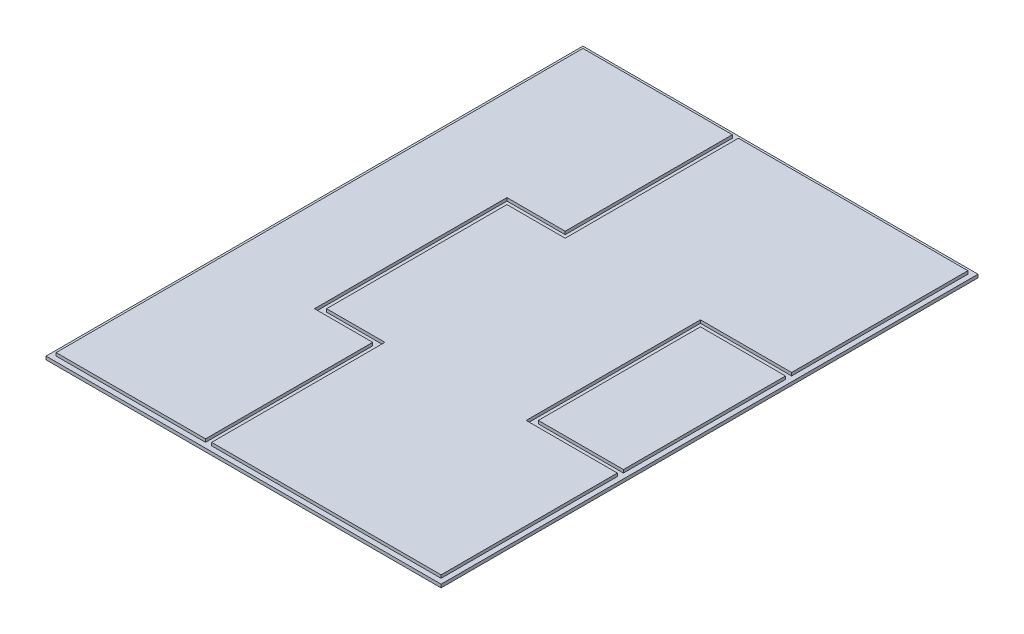
ISO-10303-21;
HEADER;
FILE_DESCRIPTION(('STEP AP214'),'2;1');
FILE_NAME('part.step','',(''),(''),'','','');
FILE_SCHEMA(('AUTOMOTIVE_DESIGN { 1 0 10303 214 1 1 1 1 }'));
ENDSEC;
DATA;
#1=APPLICATION_CONTEXT('core data for automotive mechanical design processes');
#2=APPLICATION_PROTOCOL_DEFINITION('international standard','automotive_design',2000,#1);
#3=PRODUCT_CONTEXT('',#1,'mechanical');
#4=PRODUCT('Part','Part','',(#3));
#5=PRODUCT_RELATED_PRODUCT_CATEGORY('part','',(#4));
#6=PRODUCT_DEFINITION_FORMATION('','',#4);
#7=PRODUCT_DEFINITION_CONTEXT('part definition',#1,'design');
#8=PRODUCT_DEFINITION('design','',#6,#7);
#9=PRODUCT_DEFINITION_SHAPE('','',#8);
#10=(LENGTH_UNIT() NAMED_UNIT(*) SI_UNIT(.MILLI.,.METRE.));
#11=(NAMED_UNIT(*) PLANE_ANGLE_UNIT() SI_UNIT($,.RADIAN.));
#12=(NAMED_UNIT(*) SI_UNIT($,.STERADIAN.) SOLID_ANGLE_UNIT());
#13=UNCERTAINTY_MEASURE_WITH_UNIT(LENGTH_MEASURE(1.E-05),#10,'distance_accuracy_value','');
#14=(GEOMETRIC_REPRESENTATION_CONTEXT(3) GLOBAL_UNCERTAINTY_ASSIGNED_CONTEXT((#13)) GLOBAL_UNIT_ASSIGNED_CONTEXT((#10,
#11,#12)) REPRESENTATION_CONTEXT('',''));
#15=CARTESIAN_POINT('',(0.,0.,0.));
#16=DIRECTION('',(0.,0.,1.));
#17=DIRECTION('',(1.,0.,0.));
#18=AXIS2_PLACEMENT_3D('',#15,#16,#17);
#19=CARTESIAN_POINT('',(-13.7444933920705,0.,-33.5859030837004));
#20=DIRECTION('',(0.,-1.,0.));
#21=DIRECTION('',(0.,0.,-1.));
#22=AXIS2_PLACEMENT_3D('',#19,#20,#21);
#23=PLANE('',#22);
#24=DIRECTION('',(0.,0.,1.));
#25=VECTOR('',#24,1.);
#26=CARTESIAN_POINT('',(-13.7444933920705,0.,-33.5859030837004));
#27=LINE('',#26,#25);
#28=CARTESIAN_POINT('',(-13.7444933920705,0.,-33.5859030837004));
#29=VERTEX_POINT('',#28);
#30=CARTESIAN_POINT('',(-13.7444933920705,0.,19.4140969162996));
#31=VERTEX_POINT('',#30);
#32=EDGE_CURVE('E125',#29,#31,#27,.T.);
#33=ORIENTED_EDGE('',*,*,#32,.F.);
#34=DIRECTION('',(-1.,0.,0.));
#35=VECTOR('',#34,1.);
#36=CARTESIAN_POINT('',(-13.7444933920705,0.,-33.5859030837004));
#37=LINE('',#36,#35);
#38=CARTESIAN_POINT('',(25.2555066079295,0.,-33.5859030837004));
#39=VERTEX_POINT('',#38);
#40=EDGE_CURVE('E97',#39,#29,#37,.T.);
#41=ORIENTED_EDGE('',*,*,#40,.F.);
#42=DIRECTION('',(0.,0.,-1.));
#43=VECTOR('',#42,1.);
#44=CARTESIAN_POINT('',(25.2555066079295,0.,-33.5859030837004));
#45=LINE('',#44,#43);
#46=CARTESIAN_POINT('',(25.2555066079295,0.,19.4140969162996));
#47=VERTEX_POINT('',#46);
#48=EDGE_CURVE('E91',#47,#39,#45,.T.);
#49=ORIENTED_EDGE('',*,*,#48,.F.);
#50=DIRECTION('',(1.,0.,0.));
#51=VECTOR('',#50,1.);
#52=CARTESIAN_POINT('',(-13.7444933920705,0.,19.4140969162996));
#53=LINE('',#52,#51);
#54=EDGE_CURVE('E114',#31,#47,#53,.T.);
#55=ORIENTED_EDGE('',*,*,#54,.F.);
#56=EDGE_LOOP('',(#33,#41,#49,#55));
#57=FACE_BOUND('',#56,.T.);
#58=ADVANCED_FACE('F57',(#57),#23,.T.);
#59=CARTESIAN_POINT('',(-13.7444933920705,0.32,19.4140969162996));
#60=DIRECTION('',(0.,1.,0.));
#61=DIRECTION('',(0.,0.,1.));
#62=AXIS2_PLACEMENT_3D('',#59,#60,#61);
#63=PLANE('',#62);
#64=DIRECTION('',(0.,0.,1.));
#65=VECTOR('',#64,1.);
#66=CARTESIAN_POINT('',(-13.7444933920705,0.32,-33.5859030837004));
#67=LINE('',#66,#65);
#68=CARTESIAN_POINT('',(-13.7444933920705,0.32,-33.5859030837004));
#69=VERTEX_POINT('',#68);
#70=CARTESIAN_POINT('',(-13.7444933920705,0.32,19.4140969162996));
#71=VERTEX_POINT('',#70);
#72=EDGE_CURVE('E109',#69,#71,#67,.T.);
#73=ORIENTED_EDGE('',*,*,#72,.T.);
#74=DIRECTION('',(1.,0.,0.));
#75=VECTOR('',#74,1.);
#76=CARTESIAN_POINT('',(-13.7444933920705,0.32,19.4140969162996));
#77=LINE('',#76,#75);
#78=CARTESIAN_POINT('',(25.2555066079295,0.32,19.4140969162996));
#79=VERTEX_POINT('',#78);
#80=EDGE_CURVE('E104',#71,#79,#77,.T.);
#81=ORIENTED_EDGE('',*,*,#80,.T.);
#82=DIRECTION('',(0.,0.,-1.));
#83=VECTOR('',#82,1.);
#84=CARTESIAN_POINT('',(25.2555066079295,0.32,-33.5859030837004));
#85=LINE('',#84,#83);
#86=CARTESIAN_POINT('',(25.2555066079295,0.32,-33.5859030837004));
#87=VERTEX_POINT('',#86);
#88=EDGE_CURVE('E107',#79,#87,#85,.T.);
#89=ORIENTED_EDGE('',*,*,#88,.T.);
#90=DIRECTION('',(-1.,0.,0.));
#91=VECTOR('',#90,1.);
#92=CARTESIAN_POINT('',(-13.7444933920705,0.32,-33.5859030837004));
#93=LINE('',#92,#91);
#94=EDGE_CURVE('E74',#87,#69,#93,.T.);
#95=ORIENTED_EDGE('',*,*,#94,.T.);
#96=EDGE_LOOP('',(#73,#81,#89,#95));
#97=FACE_BOUND('',#96,.T.);
#98=ADVANCED_FACE('F105',(#97),#63,.T.);
#99=CARTESIAN_POINT('',(-13.7444933920705,0.32,-33.5859030837004));
#100=DIRECTION('',(1.,0.,0.));
#101=DIRECTION('',(0.,0.,-1.));
#102=AXIS2_PLACEMENT_3D('',#99,#100,#101);
#103=PLANE('',#102);
#104=ORIENTED_EDGE('',*,*,#32,.T.);
#105=DIRECTION('',(0.,-1.,0.));
#106=VECTOR('',#105,1.);
#107=CARTESIAN_POINT('',(-13.7444933920705,0.32,19.4140969162996));
#108=LINE('',#107,#106);
#109=EDGE_CURVE('E13',#71,#31,#108,.T.);
#110=ORIENTED_EDGE('',*,*,#109,.F.);
#111=ORIENTED_EDGE('',*,*,#72,.F.);
#112=DIRECTION('',(0.,-1.,0.));
#113=VECTOR('',#112,1.);
#114=CARTESIAN_POINT('',(-13.7444933920705,0.32,-33.5859030837004));
#115=LINE('',#114,#113);
#116=EDGE_CURVE('E121',#69,#29,#115,.T.);
#117=ORIENTED_EDGE('',*,*,#116,.T.);
#118=EDGE_LOOP('',(#104,#110,#111,#117));
#119=FACE_BOUND('',#118,.T.);
#120=ADVANCED_FACE('F142',(#119),#103,.F.);
#121=CARTESIAN_POINT('',(-13.7444933920705,0.32,19.4140969162996));
#122=DIRECTION('',(0.,0.,-1.));
#123=DIRECTION('',(-1.,0.,0.));
#124=AXIS2_PLACEMENT_3D('',#121,#122,#123);
#125=PLANE('',#124);
#126=ORIENTED_EDGE('',*,*,#54,.T.);
#127=DIRECTION('',(0.,-1.,0.));
#128=VECTOR('',#127,1.);
#129=CARTESIAN_POINT('',(25.2555066079295,0.32,19.4140969162996));
#130=LINE('',#129,#128);
#131=EDGE_CURVE('E66',#79,#47,#130,.T.);
#132=ORIENTED_EDGE('',*,*,#131,.F.);
#133=ORIENTED_EDGE('',*,*,#80,.F.);
#134=ORIENTED_EDGE('',*,*,#109,.T.);
#135=EDGE_LOOP('',(#126,#132,#133,#134));
#136=FACE_BOUND('',#135,.T.);
#137=ADVANCED_FACE('F113',(#136),#125,.F.);
#138=CARTESIAN_POINT('',(25.2555066079295,0.32,-33.5859030837004));
#139=DIRECTION('',(-1.,0.,0.));
#140=DIRECTION('',(0.,0.,1.));
#141=AXIS2_PLACEMENT_3D('',#138,#139,#140);
#142=PLANE('',#141);
#143=ORIENTED_EDGE('',*,*,#48,.T.);
#144=DIRECTION('',(0.,-1.,0.));
#145=VECTOR('',#144,1.);
#146=CARTESIAN_POINT('',(25.2555066079295,0.32,-33.5859030837004));
#147=LINE('',#146,#145);
#148=EDGE_CURVE('E116',#87,#39,#147,.T.);
#149=ORIENTED_EDGE('',*,*,#148,.F.);
#150=ORIENTED_EDGE('',*,*,#88,.F.);
#151=ORIENTED_EDGE('',*,*,#131,.T.);
#152=EDGE_LOOP('',(#143,#149,#150,#151));
#153=FACE_BOUND('',#152,.T.);
#154=ADVANCED_FACE('F117',(#153),#142,.F.);
#155=CARTESIAN_POINT('',(-13.7444933920705,0.32,-33.5859030837004));
#156=DIRECTION('',(0.,0.,1.));
#157=DIRECTION('',(1.,0.,0.));
#158=AXIS2_PLACEMENT_3D('',#155,#156,#157);
#159=PLANE('',#158);
#160=ORIENTED_EDGE('',*,*,#40,.T.);
#161=ORIENTED_EDGE('',*,*,#116,.F.);
#162=ORIENTED_EDGE('',*,*,#94,.F.);
#163=ORIENTED_EDGE('',*,*,#148,.T.);
#164=EDGE_LOOP('',(#160,#161,#162,#163));
#165=FACE_BOUND('',#164,.T.);
#166=ADVANCED_FACE('F138',(#165),#159,.F.);
#167=CLOSED_SHELL('',(#58,#98,#120,#137,#154,#166));
#168=MANIFOLD_SOLID_BREP('B2',#167);
#169=CARTESIAN_POINT('',(-13.7444933920705,0.,-33.5859030837004));
#170=DIRECTION('',(0.,-1.,0.));
#171=DIRECTION('',(0.,0.,-1.));
#172=AXIS2_PLACEMENT_3D('',#169,#170,#171);
#173=PLANE('',#172);
#174=DIRECTION('',(-1.,0.,0.));
#175=VECTOR('',#174,1.);
#176=CARTESIAN_POINT('',(-13.2444933920705,0.,18.9140969162996));
#177=LINE('',#176,#175);
#178=CARTESIAN_POINT('',(24.7555066079295,0.,18.9140969162996));
#179=VERTEX_POINT('',#178);
#180=CARTESIAN_POINT('',(-13.2444933920705,0.,18.9140969162996));
#181=VERTEX_POINT('',#180);
#182=EDGE_CURVE('E284',#179,#181,#177,.T.);
#183=ORIENTED_EDGE('',*,*,#182,.F.);
#184=DIRECTION('',(0.,0.,1.));
#185=VECTOR('',#184,1.);
#186=CARTESIAN_POINT('',(24.7555066079295,0.,18.9140969162996));
#187=LINE('',#186,#185);
#188=CARTESIAN_POINT('',(24.7555066079295,0.,-33.0859030837004));
#189=VERTEX_POINT('',#188);
#190=EDGE_CURVE('E249',#189,#179,#187,.T.);
#191=ORIENTED_EDGE('',*,*,#190,.F.);
#192=DIRECTION('',(1.,0.,0.));
#193=VECTOR('',#192,1.);
#194=CARTESIAN_POINT('',(-13.2444933920705,0.,-33.0859030837004));
#195=LINE('',#194,#193);
#196=CARTESIAN_POINT('',(-13.2444933920705,0.,-33.0859030837004));
#197=VERTEX_POINT('',#196);
#198=EDGE_CURVE('E288',#197,#189,#195,.T.);
#199=ORIENTED_EDGE('',*,*,#198,.F.);
#200=DIRECTION('',(0.,0.,-1.));
#201=VECTOR('',#200,1.);
#202=CARTESIAN_POINT('',(-13.2444933920705,0.,18.9140969162996));
#203=LINE('',#202,#201);
#204=EDGE_CURVE('E241',#181,#197,#203,.T.);
#205=ORIENTED_EDGE('',*,*,#204,.F.);
#206=EDGE_LOOP('',(#183,#191,#199,#205));
#207=FACE_BOUND('',#206,.T.);
#208=ADVANCED_FACE('F227',(#207),#173,.F.);
#209=CARTESIAN_POINT('',(-13.2444933920705,-0.3,-33.0859030837004));
#210=DIRECTION('',(0.,0.,1.));
#211=DIRECTION('',(1.,0.,0.));
#212=AXIS2_PLACEMENT_3D('',#209,#210,#211);
#213=PLANE('',#212);
#214=ORIENTED_EDGE('',*,*,#198,.T.);
#215=DIRECTION('',(0.,1.,0.));
#216=VECTOR('',#215,1.);
#217=CARTESIAN_POINT('',(24.7555066079295,-0.3,-33.0859030837004));
#218=LINE('',#217,#216);
#219=CARTESIAN_POINT('',(24.7555066079295,-0.3,-33.0859030837004));
#220=VERTEX_POINT('',#219);
#221=EDGE_CURVE('E234',#220,#189,#218,.T.);
#222=ORIENTED_EDGE('',*,*,#221,.F.);
#223=DIRECTION('',(1.,0.,0.));
#224=VECTOR('',#223,1.);
#225=CARTESIAN_POINT('',(-13.2444933920705,-0.3,-33.0859030837004));
#226=LINE('',#225,#224);
#227=CARTESIAN_POINT('',(-13.2444933920705,-0.3,-33.0859030837004));
#228=VERTEX_POINT('',#227);
#229=EDGE_CURVE('E268',#228,#220,#226,.T.);
#230=ORIENTED_EDGE('',*,*,#229,.F.);
#231=DIRECTION('',(0.,1.,0.));
#232=VECTOR('',#231,1.);
#233=CARTESIAN_POINT('',(-13.2444933920705,-0.3,-33.0859030837004));
#234=LINE('',#233,#232);
#235=EDGE_CURVE('E55',#228,#197,#234,.T.);
#236=ORIENTED_EDGE('',*,*,#235,.T.);
#237=EDGE_LOOP('',(#214,#222,#230,#236));
#238=FACE_BOUND('',#237,.T.);
#239=ADVANCED_FACE('F270',(#238),#213,.F.);
#240=CARTESIAN_POINT('',(24.7555066079295,-0.3,18.9140969162996));
#241=DIRECTION('',(-1.,0.,0.));
#242=DIRECTION('',(0.,0.,1.));
#243=AXIS2_PLACEMENT_3D('',#240,#241,#242);
#244=PLANE('',#243);
#245=ORIENTED_EDGE('',*,*,#190,.T.);
#246=DIRECTION('',(0.,1.,0.));
#247=VECTOR('',#246,1.);
#248=CARTESIAN_POINT('',(24.7555066079295,-0.3,18.9140969162996));
#249=LINE('',#248,#247);
#250=CARTESIAN_POINT('',(24.7555066079295,-0.3,18.9140969162996));
#251=VERTEX_POINT('',#250);
#252=EDGE_CURVE('E296',#251,#179,#249,.T.);
#253=ORIENTED_EDGE('',*,*,#252,.F.);
#254=DIRECTION('',(0.,0.,1.));
#255=VECTOR('',#254,1.);
#256=CARTESIAN_POINT('',(24.7555066079295,-0.3,18.9140969162996));
#257=LINE('',#256,#255);
#258=EDGE_CURVE('E274',#220,#251,#257,.T.);
#259=ORIENTED_EDGE('',*,*,#258,.F.);
#260=ORIENTED_EDGE('',*,*,#221,.T.);
#261=EDGE_LOOP('',(#245,#253,#259,#260));
#262=FACE_BOUND('',#261,.T.);
#263=ADVANCED_FACE('F298',(#262),#244,.F.);
#264=CARTESIAN_POINT('',(0.,-0.3,0.));
#265=DIRECTION('',(0.,-1.,0.));
#266=DIRECTION('',(0.,0.,-1.));
#267=AXIS2_PLACEMENT_3D('',#264,#265,#266);
#268=PLANE('',#267);
#269=DIRECTION('',(0.,0.,-1.));
#270=VECTOR('',#269,1.);
#271=CARTESIAN_POINT('',(-13.2444933920705,-0.3,18.9140969162996));
#272=LINE('',#271,#270);
#273=CARTESIAN_POINT('',(-13.2444933920705,-0.3,18.9140969162996));
#274=VERTEX_POINT('',#273);
#275=EDGE_CURVE('E275',#274,#228,#272,.T.);
#276=ORIENTED_EDGE('',*,*,#275,.T.);
#277=ORIENTED_EDGE('',*,*,#229,.T.);
#278=ORIENTED_EDGE('',*,*,#258,.T.);
#279=DIRECTION('',(-1.,0.,0.));
#280=VECTOR('',#279,1.);
#281=CARTESIAN_POINT('',(-13.2444933920705,-0.3,18.9140969162996));
#282=LINE('',#281,#280);
#283=EDGE_CURVE('E280',#251,#274,#282,.T.);
#284=ORIENTED_EDGE('',*,*,#283,.T.);
#285=EDGE_LOOP('',(#276,#277,#278,#284));
#286=FACE_BOUND('',#285,.T.);
#287=ADVANCED_FACE('F278',(#286),#268,.T.);
#288=CARTESIAN_POINT('',(-13.2444933920705,-0.3,18.9140969162996));
#289=DIRECTION('',(1.,0.,0.));
#290=DIRECTION('',(0.,0.,-1.));
#291=AXIS2_PLACEMENT_3D('',#288,#289,#290);
#292=PLANE('',#291);
#293=ORIENTED_EDGE('',*,*,#204,.T.);
#294=ORIENTED_EDGE('',*,*,#235,.F.);
#295=ORIENTED_EDGE('',*,*,#275,.F.);
#296=DIRECTION('',(0.,1.,0.));
#297=VECTOR('',#296,1.);
#298=CARTESIAN_POINT('',(-13.2444933920705,-0.3,18.9140969162996));
#299=LINE('',#298,#297);
#300=EDGE_CURVE('E287',#274,#181,#299,.T.);
#301=ORIENTED_EDGE('',*,*,#300,.T.);
#302=EDGE_LOOP('',(#293,#294,#295,#301));
#303=FACE_BOUND('',#302,.T.);
#304=ADVANCED_FACE('F286',(#303),#292,.F.);
#305=CARTESIAN_POINT('',(-13.2444933920705,-0.3,18.9140969162996));
#306=DIRECTION('',(0.,0.,-1.));
#307=DIRECTION('',(-1.,0.,0.));
#308=AXIS2_PLACEMENT_3D('',#305,#306,#307);
#309=PLANE('',#308);
#310=ORIENTED_EDGE('',*,*,#182,.T.);
#311=ORIENTED_EDGE('',*,*,#300,.F.);
#312=ORIENTED_EDGE('',*,*,#283,.F.);
#313=ORIENTED_EDGE('',*,*,#252,.T.);
#314=EDGE_LOOP('',(#310,#311,#312,#313));
#315=FACE_BOUND('',#314,.T.);
#316=ADVANCED_FACE('F301',(#315),#309,.F.);
#317=CLOSED_SHELL('',(#208,#239,#263,#287,#304,#316));
#318=MANIFOLD_SOLID_BREP('B7',#317);
#319=CARTESIAN_POINT('',(-13.7444933920705,0.32,19.4140969162996));
#320=DIRECTION('',(0.,1.,0.));
#321=DIRECTION('',(0.,0.,1.));
#322=AXIS2_PLACEMENT_3D('',#319,#320,#321);
#323=PLANE('',#322);
#324=DIRECTION('',(0.,0.,-1.));
#325=VECTOR('',#324,1.);
#326=CARTESIAN_POINT('',(1.50550660792953,0.32,-16.5859030837004));
#327=LINE('',#326,#325);
#328=CARTESIAN_POINT('',(1.50550660792953,0.32,-16.5859030837004));
#329=VERTEX_POINT('',#328);
#330=CARTESIAN_POINT('',(1.50550660792953,0.32,-33.0859030837004));
#331=VERTEX_POINT('',#330);
#332=EDGE_CURVE('E479',#329,#331,#327,.T.);
#333=ORIENTED_EDGE('',*,*,#332,.F.);
#334=DIRECTION('',(1.,0.,0.));
#335=VECTOR('',#334,1.);
#336=CARTESIAN_POINT('',(-4.24449339207047,0.32,-16.5859030837004));
#337=LINE('',#336,#335);
#338=CARTESIAN_POINT('',(-4.24449339207047,0.32,-16.5859030837004));
#339=VERTEX_POINT('',#338);
#340=EDGE_CURVE('E481',#339,#329,#337,.T.);
#341=ORIENTED_EDGE('',*,*,#340,.F.);
#342=DIRECTION('',(0.,0.,-1.));
#343=VECTOR('',#342,1.);
#344=CARTESIAN_POINT('',(-4.24449339207047,0.32,2.41409691629957));
#345=LINE('',#344,#343);
#346=CARTESIAN_POINT('',(-4.24449339207047,0.32,2.41409691629957));
#347=VERTEX_POINT('',#346);
#348=EDGE_CURVE('E484',#347,#339,#345,.T.);
#349=ORIENTED_EDGE('',*,*,#348,.F.);
#350=DIRECTION('',(-1.,0.,0.));
#351=VECTOR('',#350,1.);
#352=CARTESIAN_POINT('',(1.50550660792953,0.32,2.41409691629956));
#353=LINE('',#352,#351);
#354=CARTESIAN_POINT('',(1.50550660792953,0.32,2.41409691629956));
#355=VERTEX_POINT('',#354);
#356=EDGE_CURVE('E453',#355,#347,#353,.T.);
#357=ORIENTED_EDGE('',*,*,#356,.F.);
#358=DIRECTION('',(0.,0.,-1.));
#359=VECTOR('',#358,1.);
#360=CARTESIAN_POINT('',(1.50550660792953,0.32,18.9140969162996));
#361=LINE('',#360,#359);
#362=CARTESIAN_POINT('',(1.50550660792953,0.32,18.9140969162996));
#363=VERTEX_POINT('',#362);
#364=EDGE_CURVE('E449',#363,#355,#361,.T.);
#365=ORIENTED_EDGE('',*,*,#364,.F.);
#366=DIRECTION('',(1.,0.,0.));
#367=VECTOR('',#366,1.);
#368=CARTESIAN_POINT('',(-13.2444933920705,0.32,18.9140969162996));
#369=LINE('',#368,#367);
#370=CARTESIAN_POINT('',(-13.2444933920705,0.32,18.9140969162996));
#371=VERTEX_POINT('',#370);
#372=EDGE_CURVE('E441',#371,#363,#369,.T.);
#373=ORIENTED_EDGE('',*,*,#372,.F.);
#374=DIRECTION('',(0.,0.,1.));
#375=VECTOR('',#374,1.);
#376=CARTESIAN_POINT('',(-13.2444933920705,0.32,-33.0859030837004));
#377=LINE('',#376,#375);
#378=CARTESIAN_POINT('',(-13.2444933920705,0.32,-33.0859030837004));
#379=VERTEX_POINT('',#378);
#380=EDGE_CURVE('E380',#379,#371,#377,.T.);
#381=ORIENTED_EDGE('',*,*,#380,.F.);
#382=DIRECTION('',(-1.,0.,0.));
#383=VECTOR('',#382,1.);
#384=CARTESIAN_POINT('',(1.50550660792953,0.32,-33.0859030837004));
#385=LINE('',#384,#383);
#386=EDGE_CURVE('E225',#331,#379,#385,.T.);
#387=ORIENTED_EDGE('',*,*,#386,.F.);
#388=EDGE_LOOP('',(#333,#341,#349,#357,#365,#373,#381,#387));
#389=FACE_BOUND('',#388,.T.);
#390=ADVANCED_FACE('F371',(#389),#323,.F.);
#391=CARTESIAN_POINT('',(-13.2444933920705,0.62,-33.0859030837004));
#392=DIRECTION('',(1.,0.,0.));
#393=DIRECTION('',(0.,0.,-1.));
#394=AXIS2_PLACEMENT_3D('',#391,#392,#393);
#395=PLANE('',#394);
#396=ORIENTED_EDGE('',*,*,#380,.T.);
#397=DIRECTION('',(0.,-1.,0.));
#398=VECTOR('',#397,1.);
#399=CARTESIAN_POINT('',(-13.2444933920705,0.62,18.9140969162996));
#400=LINE('',#399,#398);
#401=CARTESIAN_POINT('',(-13.2444933920705,0.62,18.9140969162996));
#402=VERTEX_POINT('',#401);
#403=EDGE_CURVE('E448',#402,#371,#400,.T.);
#404=ORIENTED_EDGE('',*,*,#403,.F.);
#405=DIRECTION('',(0.,0.,1.));
#406=VECTOR('',#405,1.);
#407=CARTESIAN_POINT('',(-13.2444933920705,0.62,-33.0859030837004));
#408=LINE('',#407,#406);
#409=CARTESIAN_POINT('',(-13.2444933920705,0.62,-33.0859030837004));
#410=VERTEX_POINT('',#409);
#411=EDGE_CURVE('E417',#410,#402,#408,.T.);
#412=ORIENTED_EDGE('',*,*,#411,.F.);
#413=DIRECTION('',(0.,-1.,0.));
#414=VECTOR('',#413,1.);
#415=CARTESIAN_POINT('',(-13.2444933920705,0.62,-33.0859030837004));
#416=LINE('',#415,#414);
#417=EDGE_CURVE('E464',#410,#379,#416,.T.);
#418=ORIENTED_EDGE('',*,*,#417,.T.);
#419=EDGE_LOOP('',(#396,#404,#412,#418));
#420=FACE_BOUND('',#419,.T.);
#421=ADVANCED_FACE('F502',(#420),#395,.F.);
#422=CARTESIAN_POINT('',(-13.2444933920705,0.62,18.9140969162996));
#423=DIRECTION('',(0.,0.,-1.));
#424=DIRECTION('',(-1.,0.,0.));
#425=AXIS2_PLACEMENT_3D('',#422,#423,#424);
#426=PLANE('',#425);
#427=ORIENTED_EDGE('',*,*,#372,.T.);
#428=DIRECTION('',(0.,-1.,0.));
#429=VECTOR('',#428,1.);
#430=CARTESIAN_POINT('',(1.50550660792953,0.62,18.9140969162996));
#431=LINE('',#430,#429);
#432=CARTESIAN_POINT('',(1.50550660792953,0.62,18.9140969162996));
#433=VERTEX_POINT('',#432);
#434=EDGE_CURVE('E446',#433,#363,#431,.T.);
#435=ORIENTED_EDGE('',*,*,#434,.F.);
#436=DIRECTION('',(1.,0.,0.));
#437=VECTOR('',#436,1.);
#438=CARTESIAN_POINT('',(-13.2444933920705,0.62,18.9140969162996));
#439=LINE('',#438,#437);
#440=EDGE_CURVE('E496',#402,#433,#439,.T.);
#441=ORIENTED_EDGE('',*,*,#440,.F.);
#442=ORIENTED_EDGE('',*,*,#403,.T.);
#443=EDGE_LOOP('',(#427,#435,#441,#442));
#444=FACE_BOUND('',#443,.T.);
#445=ADVANCED_FACE('F443',(#444),#426,.F.);
#446=CARTESIAN_POINT('',(1.50550660792953,0.62,18.9140969162996));
#447=DIRECTION('',(-1.,0.,0.));
#448=DIRECTION('',(0.,0.,1.));
#449=AXIS2_PLACEMENT_3D('',#446,#447,#448);
#450=PLANE('',#449);
#451=ORIENTED_EDGE('',*,*,#364,.T.);
#452=DIRECTION('',(0.,-1.,0.));
#453=VECTOR('',#452,1.);
#454=CARTESIAN_POINT('',(1.50550660792953,0.62,2.41409691629956));
#455=LINE('',#454,#453);
#456=CARTESIAN_POINT('',(1.50550660792953,0.62,2.41409691629956));
#457=VERTEX_POINT('',#456);
#458=EDGE_CURVE('E460',#457,#355,#455,.T.);
#459=ORIENTED_EDGE('',*,*,#458,.F.);
#460=DIRECTION('',(0.,0.,-1.));
#461=VECTOR('',#460,1.);
#462=CARTESIAN_POINT('',(1.50550660792953,0.62,18.9140969162996));
#463=LINE('',#462,#461);
#464=EDGE_CURVE('E459',#433,#457,#463,.T.);
#465=ORIENTED_EDGE('',*,*,#464,.F.);
#466=ORIENTED_EDGE('',*,*,#434,.T.);
#467=EDGE_LOOP('',(#451,#459,#465,#466));
#468=FACE_BOUND('',#467,.T.);
#469=ADVANCED_FACE('F458',(#468),#450,.F.);
#470=CARTESIAN_POINT('',(1.50550660792953,0.62,2.41409691629956));
#471=DIRECTION('',(0.,0.,1.));
#472=DIRECTION('',(1.,0.,0.));
#473=AXIS2_PLACEMENT_3D('',#470,#471,#472);
#474=PLANE('',#473);
#475=ORIENTED_EDGE('',*,*,#356,.T.);
#476=DIRECTION('',(0.,-1.,0.));
#477=VECTOR('',#476,1.);
#478=CARTESIAN_POINT('',(-4.24449339207047,0.62,2.41409691629957));
#479=LINE('',#478,#477);
#480=CARTESIAN_POINT('',(-4.24449339207047,0.62,2.41409691629957));
#481=VERTEX_POINT('',#480);
#482=EDGE_CURVE('E462',#481,#347,#479,.T.);
#483=ORIENTED_EDGE('',*,*,#482,.F.);
#484=DIRECTION('',(-1.,0.,0.));
#485=VECTOR('',#484,1.);
#486=CARTESIAN_POINT('',(1.50550660792953,0.62,2.41409691629956));
#487=LINE('',#486,#485);
#488=EDGE_CURVE('E493',#457,#481,#487,.T.);
#489=ORIENTED_EDGE('',*,*,#488,.F.);
#490=ORIENTED_EDGE('',*,*,#458,.T.);
#491=EDGE_LOOP('',(#475,#483,#489,#490));
#492=FACE_BOUND('',#491,.T.);
#493=ADVANCED_FACE('F506',(#492),#474,.F.);
#494=CARTESIAN_POINT('',(-4.24449339207047,0.62,2.41409691629957));
#495=DIRECTION('',(-1.,0.,0.));
#496=DIRECTION('',(0.,0.,1.));
#497=AXIS2_PLACEMENT_3D('',#494,#495,#496);
#498=PLANE('',#497);
#499=ORIENTED_EDGE('',*,*,#348,.T.);
#500=DIRECTION('',(0.,-1.,0.));
#501=VECTOR('',#500,1.);
#502=CARTESIAN_POINT('',(-4.24449339207047,0.62,-16.5859030837004));
#503=LINE('',#502,#501);
#504=CARTESIAN_POINT('',(-4.24449339207047,0.62,-16.5859030837004));
#505=VERTEX_POINT('',#504);
#506=EDGE_CURVE('E470',#505,#339,#503,.T.);
#507=ORIENTED_EDGE('',*,*,#506,.F.);
#508=DIRECTION('',(0.,0.,-1.));
#509=VECTOR('',#508,1.);
#510=CARTESIAN_POINT('',(-4.24449339207047,0.62,2.41409691629957));
#511=LINE('',#510,#509);
#512=EDGE_CURVE('E491',#481,#505,#511,.T.);
#513=ORIENTED_EDGE('',*,*,#512,.F.);
#514=ORIENTED_EDGE('',*,*,#482,.T.);
#515=EDGE_LOOP('',(#499,#507,#513,#514));
#516=FACE_BOUND('',#515,.T.);
#517=ADVANCED_FACE('F510',(#516),#498,.F.);
#518=CARTESIAN_POINT('',(-4.24449339207047,0.62,-16.5859030837004));
#519=DIRECTION('',(0.,0.,-1.));
#520=DIRECTION('',(-1.,0.,0.));
#521=AXIS2_PLACEMENT_3D('',#518,#519,#520);
#522=PLANE('',#521);
#523=ORIENTED_EDGE('',*,*,#340,.T.);
#524=DIRECTION('',(0.,-1.,0.));
#525=VECTOR('',#524,1.);
#526=CARTESIAN_POINT('',(1.50550660792953,0.62,-16.5859030837004));
#527=LINE('',#526,#525);
#528=CARTESIAN_POINT('',(1.50550660792953,0.62,-16.5859030837004));
#529=VERTEX_POINT('',#528);
#530=EDGE_CURVE('E473',#529,#329,#527,.T.);
#531=ORIENTED_EDGE('',*,*,#530,.F.);
#532=DIRECTION('',(1.,0.,0.));
#533=VECTOR('',#532,1.);
#534=CARTESIAN_POINT('',(-4.24449339207047,0.62,-16.5859030837004));
#535=LINE('',#534,#533);
#536=EDGE_CURVE('E489',#505,#529,#535,.T.);
#537=ORIENTED_EDGE('',*,*,#536,.F.);
#538=ORIENTED_EDGE('',*,*,#506,.T.);
#539=EDGE_LOOP('',(#523,#531,#537,#538));
#540=FACE_BOUND('',#539,.T.);
#541=ADVANCED_FACE('F514',(#540),#522,.F.);
#542=CARTESIAN_POINT('',(0.,0.62,0.));
#543=DIRECTION('',(0.,1.,0.));
#544=DIRECTION('',(0.,0.,1.));
#545=AXIS2_PLACEMENT_3D('',#542,#543,#544);
#546=PLANE('',#545);
#547=DIRECTION('',(-1.,0.,0.));
#548=VECTOR('',#547,1.);
#549=CARTESIAN_POINT('',(1.50550660792953,0.62,-33.0859030837004));
#550=LINE('',#549,#548);
#551=CARTESIAN_POINT('',(1.50550660792953,0.62,-33.0859030837004));
#552=VERTEX_POINT('',#551);
#553=EDGE_CURVE('E374',#552,#410,#550,.T.);
#554=ORIENTED_EDGE('',*,*,#553,.T.);
#555=ORIENTED_EDGE('',*,*,#411,.T.);
#556=ORIENTED_EDGE('',*,*,#440,.T.);
#557=ORIENTED_EDGE('',*,*,#464,.T.);
#558=ORIENTED_EDGE('',*,*,#488,.T.);
#559=ORIENTED_EDGE('',*,*,#512,.T.);
#560=ORIENTED_EDGE('',*,*,#536,.T.);
#561=DIRECTION('',(0.,0.,-1.));
#562=VECTOR('',#561,1.);
#563=CARTESIAN_POINT('',(1.50550660792953,0.62,-16.5859030837004));
#564=LINE('',#563,#562);
#565=EDGE_CURVE('E478',#529,#552,#564,.T.);
#566=ORIENTED_EDGE('',*,*,#565,.T.);
#567=EDGE_LOOP('',(#554,#555,#556,#557,#558,#559,#560,#566));
#568=FACE_BOUND('',#567,.T.);
#569=ADVANCED_FACE('F498',(#568),#546,.T.);
#570=CARTESIAN_POINT('',(1.50550660792953,0.62,-33.0859030837004));
#571=DIRECTION('',(0.,0.,1.));
#572=DIRECTION('',(1.,0.,0.));
#573=AXIS2_PLACEMENT_3D('',#570,#571,#572);
#574=PLANE('',#573);
#575=ORIENTED_EDGE('',*,*,#386,.T.);
#576=ORIENTED_EDGE('',*,*,#417,.F.);
#577=ORIENTED_EDGE('',*,*,#553,.F.);
#578=DIRECTION('',(0.,-1.,0.));
#579=VECTOR('',#578,1.);
#580=CARTESIAN_POINT('',(1.50550660792953,0.62,-33.0859030837004));
#581=LINE('',#580,#579);
#582=EDGE_CURVE('E476',#552,#331,#581,.T.);
#583=ORIENTED_EDGE('',*,*,#582,.T.);
#584=EDGE_LOOP('',(#575,#576,#577,#583));
#585=FACE_BOUND('',#584,.T.);
#586=ADVANCED_FACE('F501',(#585),#574,.F.);
#587=CARTESIAN_POINT('',(1.50550660792953,0.62,-16.5859030837004));
#588=DIRECTION('',(-1.,0.,0.));
#589=DIRECTION('',(0.,0.,1.));
#590=AXIS2_PLACEMENT_3D('',#587,#588,#589);
#591=PLANE('',#590);
#592=ORIENTED_EDGE('',*,*,#332,.T.);
#593=ORIENTED_EDGE('',*,*,#582,.F.);
#594=ORIENTED_EDGE('',*,*,#565,.F.);
#595=ORIENTED_EDGE('',*,*,#530,.T.);
#596=EDGE_LOOP('',(#592,#593,#594,#595));
#597=FACE_BOUND('',#596,.T.);
#598=ADVANCED_FACE('F517',(#597),#591,.F.);
#599=CLOSED_SHELL('',(#390,#421,#445,#469,#493,#517,#541,#569,#586,#598));
#600=MANIFOLD_SOLID_BREP('B49',#599);
#601=CARTESIAN_POINT('',(-13.7444933920705,0.32,19.4140969162996));
#602=DIRECTION('',(0.,1.,0.));
#603=DIRECTION('',(0.,0.,1.));
#604=AXIS2_PLACEMENT_3D('',#601,#602,#603);
#605=PLANE('',#604);
#606=DIRECTION('',(-1.,0.,0.));
#607=VECTOR('',#606,1.);
#608=CARTESIAN_POINT('',(2.10550660792953,0.32,-33.0859030837004));
#609=LINE('',#608,#607);
#610=CARTESIAN_POINT('',(24.7555066079295,0.32,-33.0859030837004));
#611=VERTEX_POINT('',#610);
#612=CARTESIAN_POINT('',(2.10550660792953,0.32,-33.0859030837004));
#613=VERTEX_POINT('',#612);
#614=EDGE_CURVE('E766',#611,#613,#609,.T.);
#615=ORIENTED_EDGE('',*,*,#614,.F.);
#616=DIRECTION('',(0.,0.,-1.));
#617=VECTOR('',#616,1.);
#618=CARTESIAN_POINT('',(24.7555066079295,0.32,-33.0859030837004));
#619=LINE('',#618,#617);
#620=CARTESIAN_POINT('',(24.7555066079295,0.32,-15.6859030837004));
#621=VERTEX_POINT('',#620);
#622=EDGE_CURVE('E764',#621,#611,#619,.T.);
#623=ORIENTED_EDGE('',*,*,#622,.F.);
#624=DIRECTION('',(1.,0.,0.));
#625=VECTOR('',#624,1.);
#626=CARTESIAN_POINT('',(24.7555066079295,0.32,-15.6859030837004));
#627=LINE('',#626,#625);
#628=CARTESIAN_POINT('',(15.7555066079295,0.32,-15.6859030837004));
#629=VERTEX_POINT('',#628);
#630=EDGE_CURVE('E681',#629,#621,#627,.T.);
#631=ORIENTED_EDGE('',*,*,#630,.F.);
#632=DIRECTION('',(0.,0.,-1.));
#633=VECTOR('',#632,1.);
#634=CARTESIAN_POINT('',(15.7555066079295,0.32,-15.6859030837004));
#635=LINE('',#634,#633);
#636=CARTESIAN_POINT('',(15.7555066079295,0.32,1.51409691629956));
#637=VERTEX_POINT('',#636);
#638=EDGE_CURVE('E761',#637,#629,#635,.T.);
#639=ORIENTED_EDGE('',*,*,#638,.F.);
#640=DIRECTION('',(-1.,0.,0.));
#641=VECTOR('',#640,1.);
#642=CARTESIAN_POINT('',(15.7555066079295,0.32,1.51409691629956));
#643=LINE('',#642,#641);
#644=CARTESIAN_POINT('',(24.7555066079295,0.32,1.51409691629956));
#645=VERTEX_POINT('',#644);
#646=EDGE_CURVE('E759',#645,#637,#643,.T.);
#647=ORIENTED_EDGE('',*,*,#646,.F.);
#648=DIRECTION('',(0.,0.,-1.));
#649=VECTOR('',#648,1.);
#650=CARTESIAN_POINT('',(24.7555066079295,0.32,1.51409691629956));
#651=LINE('',#650,#649);
#652=CARTESIAN_POINT('',(24.7555066079295,0.32,18.9140969162996));
#653=VERTEX_POINT('',#652);
#654=EDGE_CURVE('E757',#653,#645,#651,.T.);
#655=ORIENTED_EDGE('',*,*,#654,.F.);
#656=DIRECTION('',(1.,0.,0.));
#657=VECTOR('',#656,1.);
#658=CARTESIAN_POINT('',(24.7555066079295,0.32,18.9140969162996));
#659=LINE('',#658,#657);
#660=CARTESIAN_POINT('',(2.10550660792953,0.32,18.9140969162996));
#661=VERTEX_POINT('',#660);
#662=EDGE_CURVE('E755',#661,#653,#659,.T.);
#663=ORIENTED_EDGE('',*,*,#662,.F.);
#664=DIRECTION('',(0.,0.,1.));
#665=VECTOR('',#664,1.);
#666=CARTESIAN_POINT('',(2.10550660792953,0.32,18.9140969162996));
#667=LINE('',#666,#665);
#668=CARTESIAN_POINT('',(2.10550660792953,0.32,1.81409691629956));
#669=VERTEX_POINT('',#668);
#670=EDGE_CURVE('E753',#669,#661,#667,.T.);
#671=ORIENTED_EDGE('',*,*,#670,.F.);
#672=DIRECTION('',(1.,0.,0.));
#673=VECTOR('',#672,1.);
#674=CARTESIAN_POINT('',(2.10550660792953,0.32,1.81409691629956));
#675=LINE('',#674,#673);
#676=CARTESIAN_POINT('',(-3.64449339207047,0.32,1.81409691629957));
#677=VERTEX_POINT('',#676);
#678=EDGE_CURVE('E751',#677,#669,#675,.T.);
#679=ORIENTED_EDGE('',*,*,#678,.F.);
#680=DIRECTION('',(0.,0.,1.));
#681=VECTOR('',#680,1.);
#682=CARTESIAN_POINT('',(-3.64449339207047,0.32,1.81409691629957));
#683=LINE('',#682,#681);
#684=CARTESIAN_POINT('',(-3.64449339207047,0.32,-15.9859030837004));
#685=VERTEX_POINT('',#684);
#686=EDGE_CURVE('E749',#685,#677,#683,.T.);
#687=ORIENTED_EDGE('',*,*,#686,.F.);
#688=DIRECTION('',(-1.,0.,0.));
#689=VECTOR('',#688,1.);
#690=CARTESIAN_POINT('',(-3.64449339207047,0.32,-15.9859030837004));
#691=LINE('',#690,#689);
#692=CARTESIAN_POINT('',(2.10550660792953,0.32,-15.9859030837004));
#693=VERTEX_POINT('',#692);
#694=EDGE_CURVE('E747',#693,#685,#691,.T.);
#695=ORIENTED_EDGE('',*,*,#694,.F.);
#696=DIRECTION('',(0.,0.,1.));
#697=VECTOR('',#696,1.);
#698=CARTESIAN_POINT('',(2.10550660792953,0.32,-15.9859030837004));
#699=LINE('',#698,#697);
#700=EDGE_CURVE('E688',#613,#693,#699,.T.);
#701=ORIENTED_EDGE('',*,*,#700,.F.);
#702=EDGE_LOOP('',(#615,#623,#631,#639,#647,#655,#663,#671,#679,#687,#695,#701));
#703=FACE_BOUND('',#702,.T.);
#704=ADVANCED_FACE('F626',(#703),#605,.F.);
#705=CARTESIAN_POINT('',(-3.64449339207047,0.62,-15.9859030837004));
#706=DIRECTION('',(0.,0.,1.));
#707=DIRECTION('',(1.,0.,0.));
#708=AXIS2_PLACEMENT_3D('',#705,#706,#707);
#709=PLANE('',#708);
#710=ORIENTED_EDGE('',*,*,#694,.T.);
#711=DIRECTION('',(0.,-1.,0.));
#712=VECTOR('',#711,1.);
#713=CARTESIAN_POINT('',(-3.64449339207047,0.62,-15.9859030837004));
#714=LINE('',#713,#712);
#715=CARTESIAN_POINT('',(-3.64449339207047,0.62,-15.9859030837004));
#716=VERTEX_POINT('',#715);
#717=EDGE_CURVE('E634',#716,#685,#714,.T.);
#718=ORIENTED_EDGE('',*,*,#717,.F.);
#719=DIRECTION('',(-1.,0.,0.));
#720=VECTOR('',#719,1.);
#721=CARTESIAN_POINT('',(-3.64449339207047,0.62,-15.9859030837004));
#722=LINE('',#721,#720);
#723=CARTESIAN_POINT('',(2.10550660792953,0.62,-15.9859030837004));
#724=VERTEX_POINT('',#723);
#725=EDGE_CURVE('E696',#724,#716,#722,.T.);
#726=ORIENTED_EDGE('',*,*,#725,.F.);
#727=DIRECTION('',(0.,-1.,0.));
#728=VECTOR('',#727,1.);
#729=CARTESIAN_POINT('',(2.10550660792953,0.62,-15.9859030837004));
#730=LINE('',#729,#728);
#731=EDGE_CURVE('E369',#724,#693,#730,.T.);
#732=ORIENTED_EDGE('',*,*,#731,.T.);
#733=EDGE_LOOP('',(#710,#718,#726,#732));
#734=FACE_BOUND('',#733,.T.);
#735=ADVANCED_FACE('F798',(#734),#709,.F.);
#736=CARTESIAN_POINT('',(-3.64449339207047,0.62,1.81409691629957));
#737=DIRECTION('',(1.,0.,0.));
#738=DIRECTION('',(0.,0.,-1.));
#739=AXIS2_PLACEMENT_3D('',#736,#737,#738);
#740=PLANE('',#739);
#741=ORIENTED_EDGE('',*,*,#686,.T.);
#742=DIRECTION('',(0.,-1.,0.));
#743=VECTOR('',#742,1.);
#744=CARTESIAN_POINT('',(-3.64449339207047,0.62,1.81409691629957));
#745=LINE('',#744,#743);
#746=CARTESIAN_POINT('',(-3.64449339207047,0.62,1.81409691629957));
#747=VERTEX_POINT('',#746);
#748=EDGE_CURVE('E788',#747,#677,#745,.T.);
#749=ORIENTED_EDGE('',*,*,#748,.F.);
#750=DIRECTION('',(0.,0.,1.));
#751=VECTOR('',#750,1.);
#752=CARTESIAN_POINT('',(-3.64449339207047,0.62,1.81409691629957));
#753=LINE('',#752,#751);
#754=EDGE_CURVE('E797',#716,#747,#753,.T.);
#755=ORIENTED_EDGE('',*,*,#754,.F.);
#756=ORIENTED_EDGE('',*,*,#717,.T.);
#757=EDGE_LOOP('',(#741,#749,#755,#756));
#758=FACE_BOUND('',#757,.T.);
#759=ADVANCED_FACE('F793',(#758),#740,.F.);
#760=CARTESIAN_POINT('',(2.10550660792953,0.62,1.81409691629956));
#761=DIRECTION('',(0.,0.,-1.));
#762=DIRECTION('',(-1.,0.,0.));
#763=AXIS2_PLACEMENT_3D('',#760,#761,#762);
#764=PLANE('',#763);
#765=ORIENTED_EDGE('',*,*,#678,.T.);
#766=DIRECTION('',(0.,-1.,0.));
#767=VECTOR('',#766,1.);
#768=CARTESIAN_POINT('',(2.10550660792953,0.62,1.81409691629956));
#769=LINE('',#768,#767);
#770=CARTESIAN_POINT('',(2.10550660792953,0.62,1.81409691629956));
#771=VERTEX_POINT('',#770);
#772=EDGE_CURVE('E785',#771,#669,#769,.T.);
#773=ORIENTED_EDGE('',*,*,#772,.F.);
#774=DIRECTION('',(1.,0.,0.));
#775=VECTOR('',#774,1.);
#776=CARTESIAN_POINT('',(2.10550660792953,0.62,1.81409691629956));
#777=LINE('',#776,#775);
#778=EDGE_CURVE('E806',#747,#771,#777,.T.);
#779=ORIENTED_EDGE('',*,*,#778,.F.);
#780=ORIENTED_EDGE('',*,*,#748,.T.);
#781=EDGE_LOOP('',(#765,#773,#779,#780));
#782=FACE_BOUND('',#781,.T.);
#783=ADVANCED_FACE('F805',(#782),#764,.F.);
#784=CARTESIAN_POINT('',(2.10550660792953,0.62,18.9140969162996));
#785=DIRECTION('',(1.,0.,0.));
#786=DIRECTION('',(0.,0.,-1.));
#787=AXIS2_PLACEMENT_3D('',#784,#785,#786);
#788=PLANE('',#787);
#789=ORIENTED_EDGE('',*,*,#670,.T.);
#790=DIRECTION('',(0.,-1.,0.));
#791=VECTOR('',#790,1.);
#792=CARTESIAN_POINT('',(2.10550660792953,0.62,18.9140969162996));
#793=LINE('',#792,#791);
#794=CARTESIAN_POINT('',(2.10550660792953,0.62,18.9140969162996));
#795=VERTEX_POINT('',#794);
#796=EDGE_CURVE('E782',#795,#661,#793,.T.);
#797=ORIENTED_EDGE('',*,*,#796,.F.);
#798=DIRECTION('',(0.,0.,1.));
#799=VECTOR('',#798,1.);
#800=CARTESIAN_POINT('',(2.10550660792953,0.62,18.9140969162996));
#801=LINE('',#800,#799);
#802=EDGE_CURVE('E808',#771,#795,#801,.T.);
#803=ORIENTED_EDGE('',*,*,#802,.F.);
#804=ORIENTED_EDGE('',*,*,#772,.T.);
#805=EDGE_LOOP('',(#789,#797,#803,#804));
#806=FACE_BOUND('',#805,.T.);
#807=ADVANCED_FACE('F854',(#806),#788,.F.);
#808=CARTESIAN_POINT('',(24.7555066079295,0.62,18.9140969162996));
#809=DIRECTION('',(0.,0.,-1.));
#810=DIRECTION('',(-1.,0.,0.));
#811=AXIS2_PLACEMENT_3D('',#808,#809,#810);
#812=PLANE('',#811);
#813=ORIENTED_EDGE('',*,*,#662,.T.);
#814=DIRECTION('',(0.,-1.,0.));
#815=VECTOR('',#814,1.);
#816=CARTESIAN_POINT('',(24.7555066079295,0.62,18.9140969162996));
#817=LINE('',#816,#815);
#818=CARTESIAN_POINT('',(24.7555066079295,0.62,18.9140969162996));
#819=VERTEX_POINT('',#818);
#820=EDGE_CURVE('E779',#819,#653,#817,.T.);
#821=ORIENTED_EDGE('',*,*,#820,.F.);
#822=DIRECTION('',(1.,0.,0.));
#823=VECTOR('',#822,1.);
#824=CARTESIAN_POINT('',(24.7555066079295,0.62,18.9140969162996));
#825=LINE('',#824,#823);
#826=EDGE_CURVE('E810',#795,#819,#825,.T.);
#827=ORIENTED_EDGE('',*,*,#826,.F.);
#828=ORIENTED_EDGE('',*,*,#796,.T.);
#829=EDGE_LOOP('',(#813,#821,#827,#828));
#830=FACE_BOUND('',#829,.T.);
#831=ADVANCED_FACE('F857',(#830),#812,.F.);
#832=CARTESIAN_POINT('',(24.7555066079295,0.62,1.51409691629956));
#833=DIRECTION('',(-1.,0.,0.));
#834=DIRECTION('',(0.,0.,1.));
#835=AXIS2_PLACEMENT_3D('',#832,#833,#834);
#836=PLANE('',#835);
#837=ORIENTED_EDGE('',*,*,#654,.T.);
#838=DIRECTION('',(0.,-1.,0.));
#839=VECTOR('',#838,1.);
#840=CARTESIAN_POINT('',(24.7555066079295,0.62,1.51409691629956));
#841=LINE('',#840,#839);
#842=CARTESIAN_POINT('',(24.7555066079295,0.62,1.51409691629956));
#843=VERTEX_POINT('',#842);
#844=EDGE_CURVE('E776',#843,#645,#841,.T.);
#845=ORIENTED_EDGE('',*,*,#844,.F.);
#846=DIRECTION('',(0.,0.,-1.));
#847=VECTOR('',#846,1.);
#848=CARTESIAN_POINT('',(24.7555066079295,0.62,1.51409691629956));
#849=LINE('',#848,#847);
#850=EDGE_CURVE('E816',#819,#843,#849,.T.);
#851=ORIENTED_EDGE('',*,*,#850,.F.);
#852=ORIENTED_EDGE('',*,*,#820,.T.);
#853=EDGE_LOOP('',(#837,#845,#851,#852));
#854=FACE_BOUND('',#853,.T.);
#855=ADVANCED_FACE('F861',(#854),#836,.F.);
#856=CARTESIAN_POINT('',(15.7555066079295,0.62,1.51409691629956));
#857=DIRECTION('',(0.,0.,1.));
#858=DIRECTION('',(1.,0.,0.));
#859=AXIS2_PLACEMENT_3D('',#856,#857,#858);
#860=PLANE('',#859);
#861=ORIENTED_EDGE('',*,*,#646,.T.);
#862=DIRECTION('',(0.,-1.,0.));
#863=VECTOR('',#862,1.);
#864=CARTESIAN_POINT('',(15.7555066079295,0.62,1.51409691629956));
#865=LINE('',#864,#863);
#866=CARTESIAN_POINT('',(15.7555066079295,0.62,1.51409691629956));
#867=VERTEX_POINT('',#866);
#868=EDGE_CURVE('E773',#867,#637,#865,.T.);
#869=ORIENTED_EDGE('',*,*,#868,.F.);
#870=DIRECTION('',(-1.,0.,0.));
#871=VECTOR('',#870,1.);
#872=CARTESIAN_POINT('',(15.7555066079295,0.62,1.51409691629956));
#873=LINE('',#872,#871);
#874=EDGE_CURVE('E818',#843,#867,#873,.T.);
#875=ORIENTED_EDGE('',*,*,#874,.F.);
#876=ORIENTED_EDGE('',*,*,#844,.T.);
#877=EDGE_LOOP('',(#861,#869,#875,#876));
#878=FACE_BOUND('',#877,.T.);
#879=ADVANCED_FACE('F824',(#878),#860,.F.);
#880=CARTESIAN_POINT('',(15.7555066079295,0.62,-15.6859030837004));
#881=DIRECTION('',(-1.,0.,0.));
#882=DIRECTION('',(0.,0.,1.));
#883=AXIS2_PLACEMENT_3D('',#880,#881,#882);
#884=PLANE('',#883);
#885=ORIENTED_EDGE('',*,*,#638,.T.);
#886=DIRECTION('',(0.,-1.,0.));
#887=VECTOR('',#886,1.);
#888=CARTESIAN_POINT('',(15.7555066079295,0.62,-15.6859030837004));
#889=LINE('',#888,#887);
#890=CARTESIAN_POINT('',(15.7555066079295,0.62,-15.6859030837004));
#891=VERTEX_POINT('',#890);
#892=EDGE_CURVE('E736',#891,#629,#889,.T.);
#893=ORIENTED_EDGE('',*,*,#892,.F.);
#894=DIRECTION('',(0.,0.,-1.));
#895=VECTOR('',#894,1.);
#896=CARTESIAN_POINT('',(15.7555066079295,0.62,-15.6859030837004));
#897=LINE('',#896,#895);
#898=EDGE_CURVE('E728',#867,#891,#897,.T.);
#899=ORIENTED_EDGE('',*,*,#898,.F.);
#900=ORIENTED_EDGE('',*,*,#868,.T.);
#901=EDGE_LOOP('',(#885,#893,#899,#900));
#902=FACE_BOUND('',#901,.T.);
#903=ADVANCED_FACE('F828',(#902),#884,.F.);
#904=CARTESIAN_POINT('',(24.7555066079295,0.62,-15.6859030837004));
#905=DIRECTION('',(0.,0.,-1.));
#906=DIRECTION('',(-1.,0.,0.));
#907=AXIS2_PLACEMENT_3D('',#904,#905,#906);
#908=PLANE('',#907);
#909=ORIENTED_EDGE('',*,*,#630,.T.);
#910=DIRECTION('',(0.,-1.,0.));
#911=VECTOR('',#910,1.);
#912=CARTESIAN_POINT('',(24.7555066079295,0.62,-15.6859030837004));
#913=LINE('',#912,#911);
#914=CARTESIAN_POINT('',(24.7555066079295,0.62,-15.6859030837004));
#915=VERTEX_POINT('',#914);
#916=EDGE_CURVE('E732',#915,#621,#913,.T.);
#917=ORIENTED_EDGE('',*,*,#916,.F.);
#918=DIRECTION('',(1.,0.,0.));
#919=VECTOR('',#918,1.);
#920=CARTESIAN_POINT('',(24.7555066079295,0.62,-15.6859030837004));
#921=LINE('',#920,#919);
#922=EDGE_CURVE('E722',#891,#915,#921,.T.);
#923=ORIENTED_EDGE('',*,*,#922,.F.);
#924=ORIENTED_EDGE('',*,*,#892,.T.);
#925=EDGE_LOOP('',(#909,#917,#923,#924));
#926=FACE_BOUND('',#925,.T.);
#927=ADVANCED_FACE('F733',(#926),#908,.F.);
#928=CARTESIAN_POINT('',(24.7555066079295,0.62,-33.0859030837004));
#929=DIRECTION('',(-1.,0.,0.));
#930=DIRECTION('',(0.,0.,1.));
#931=AXIS2_PLACEMENT_3D('',#928,#929,#930);
#932=PLANE('',#931);
#933=ORIENTED_EDGE('',*,*,#622,.T.);
#934=DIRECTION('',(0.,-1.,0.));
#935=VECTOR('',#934,1.);
#936=CARTESIAN_POINT('',(24.7555066079295,0.62,-33.0859030837004));
#937=LINE('',#936,#935);
#938=CARTESIAN_POINT('',(24.7555066079295,0.62,-33.0859030837004));
#939=VERTEX_POINT('',#938);
#940=EDGE_CURVE('E737',#939,#611,#937,.T.);
#941=ORIENTED_EDGE('',*,*,#940,.F.);
#942=DIRECTION('',(0.,0.,-1.));
#943=VECTOR('',#942,1.);
#944=CARTESIAN_POINT('',(24.7555066079295,0.62,-33.0859030837004));
#945=LINE('',#944,#943);
#946=EDGE_CURVE('E725',#915,#939,#945,.T.);
#947=ORIENTED_EDGE('',*,*,#946,.F.);
#948=ORIENTED_EDGE('',*,*,#916,.T.);
#949=EDGE_LOOP('',(#933,#941,#947,#948));
#950=FACE_BOUND('',#949,.T.);
#951=ADVANCED_FACE('F739',(#950),#932,.F.);
#952=CARTESIAN_POINT('',(0.,0.62,0.));
#953=DIRECTION('',(0.,-1.,0.));
#954=DIRECTION('',(0.,0.,-1.));
#955=AXIS2_PLACEMENT_3D('',#952,#953,#954);
#956=PLANE('',#955);
#957=DIRECTION('',(0.,0.,1.));
#958=VECTOR('',#957,1.);
#959=CARTESIAN_POINT('',(2.10550660792953,0.62,-15.9859030837004));
#960=LINE('',#959,#958);
#961=CARTESIAN_POINT('',(2.10550660792953,0.62,-33.0859030837004));
#962=VERTEX_POINT('',#961);
#963=EDGE_CURVE('E768',#962,#724,#960,.T.);
#964=ORIENTED_EDGE('',*,*,#963,.T.);
#965=ORIENTED_EDGE('',*,*,#725,.T.);
#966=ORIENTED_EDGE('',*,*,#754,.T.);
#967=ORIENTED_EDGE('',*,*,#778,.T.);
#968=ORIENTED_EDGE('',*,*,#802,.T.);
#969=ORIENTED_EDGE('',*,*,#826,.T.);
#970=ORIENTED_EDGE('',*,*,#850,.T.);
#971=ORIENTED_EDGE('',*,*,#874,.T.);
#972=ORIENTED_EDGE('',*,*,#898,.T.);
#973=ORIENTED_EDGE('',*,*,#922,.T.);
#974=ORIENTED_EDGE('',*,*,#946,.T.);
#975=DIRECTION('',(-1.,0.,0.));
#976=VECTOR('',#975,1.);
#977=CARTESIAN_POINT('',(2.10550660792953,0.62,-33.0859030837004));
#978=LINE('',#977,#976);
#979=EDGE_CURVE('E642',#939,#962,#978,.T.);
#980=ORIENTED_EDGE('',*,*,#979,.T.);
#981=EDGE_LOOP('',(#964,#965,#966,#967,#968,#969,#970,#971,#972,#973,#974,#980));
#982=FACE_BOUND('',#981,.T.);
#983=ADVANCED_FACE('F723',(#982),#956,.F.);
#984=CARTESIAN_POINT('',(2.10550660792953,0.62,-15.9859030837004));
#985=DIRECTION('',(1.,0.,0.));
#986=DIRECTION('',(0.,0.,-1.));
#987=AXIS2_PLACEMENT_3D('',#984,#985,#986);
#988=PLANE('',#987);
#989=ORIENTED_EDGE('',*,*,#700,.T.);
#990=ORIENTED_EDGE('',*,*,#731,.F.);
#991=ORIENTED_EDGE('',*,*,#963,.F.);
#992=DIRECTION('',(0.,-1.,0.));
#993=VECTOR('',#992,1.);
#994=CARTESIAN_POINT('',(2.10550660792953,0.62,-33.0859030837004));
#995=LINE('',#994,#993);
#996=EDGE_CURVE('E742',#962,#613,#995,.T.);
#997=ORIENTED_EDGE('',*,*,#996,.T.);
#998=EDGE_LOOP('',(#989,#990,#991,#997));
#999=FACE_BOUND('',#998,.T.);
#1000=ADVANCED_FACE('F833',(#999),#988,.F.);
#1001=CARTESIAN_POINT('',(2.10550660792953,0.62,-33.0859030837004));
#1002=DIRECTION('',(0.,0.,1.));
#1003=DIRECTION('',(1.,0.,0.));
#1004=AXIS2_PLACEMENT_3D('',#1001,#1002,#1003);
#1005=PLANE('',#1004);
#1006=ORIENTED_EDGE('',*,*,#614,.T.);
#1007=ORIENTED_EDGE('',*,*,#996,.F.);
#1008=ORIENTED_EDGE('',*,*,#979,.F.);
#1009=ORIENTED_EDGE('',*,*,#940,.T.);
#1010=EDGE_LOOP('',(#1006,#1007,#1008,#1009));
#1011=FACE_BOUND('',#1010,.T.);
#1012=ADVANCED_FACE('F830',(#1011),#1005,.F.);
#1013=CLOSED_SHELL('',(#704,#735,#759,#783,#807,#831,#855,#879,#903,#927,#951,#983,#1000,#1012));
#1014=MANIFOLD_SOLID_BREP('B219',#1013);
#1015=CARTESIAN_POINT('',(-13.7444933920705,0.32,19.4140969162996));
#1016=DIRECTION('',(0.,1.,0.));
#1017=DIRECTION('',(0.,0.,1.));
#1018=AXIS2_PLACEMENT_3D('',#1015,#1016,#1017);
#1019=PLANE('',#1018);
#1020=DIRECTION('',(-1.,0.,0.));
#1021=VECTOR('',#1020,1.);
#1022=CARTESIAN_POINT('',(16.3555066079295,0.32,-15.0859030837004));
#1023=LINE('',#1022,#1021);
#1024=CARTESIAN_POINT('',(24.7555066079295,0.32,-15.0859030837004));
#1025=VERTEX_POINT('',#1024);
#1026=CARTESIAN_POINT('',(16.3555066079295,0.32,-15.0859030837004));
#1027=VERTEX_POINT('',#1026);
#1028=EDGE_CURVE('E1031',#1025,#1027,#1023,.T.);
#1029=ORIENTED_EDGE('',*,*,#1028,.F.);
#1030=DIRECTION('',(0.,0.,-1.));
#1031=VECTOR('',#1030,1.);
#1032=CARTESIAN_POINT('',(24.7555066079295,0.32,-15.0859030837004));
#1033=LINE('',#1032,#1031);
#1034=CARTESIAN_POINT('',(24.7555066079295,0.32,0.914096916299565));
#1035=VERTEX_POINT('',#1034);
#1036=EDGE_CURVE('E1000',#1035,#1025,#1033,.T.);
#1037=ORIENTED_EDGE('',*,*,#1036,.F.);
#1038=DIRECTION('',(1.,0.,0.));
#1039=VECTOR('',#1038,1.);
#1040=CARTESIAN_POINT('',(16.3555066079295,0.32,0.914096916299565));
#1041=LINE('',#1040,#1039);
#1042=CARTESIAN_POINT('',(16.3555066079295,0.32,0.914096916299565));
#1043=VERTEX_POINT('',#1042);
#1044=EDGE_CURVE('E992',#1043,#1035,#1041,.T.);
#1045=ORIENTED_EDGE('',*,*,#1044,.F.);
#1046=DIRECTION('',(0.,0.,1.));
#1047=VECTOR('',#1046,1.);
#1048=CARTESIAN_POINT('',(16.3555066079295,0.32,-15.0859030837004));
#1049=LINE('',#1048,#1047);
#1050=EDGE_CURVE('E624',#1027,#1043,#1049,.T.);
#1051=ORIENTED_EDGE('',*,*,#1050,.F.);
#1052=EDGE_LOOP('',(#1029,#1037,#1045,#1051));
#1053=FACE_BOUND('',#1052,.T.);
#1054=ADVANCED_FACE('F984',(#1053),#1019,.F.);
#1055=CARTESIAN_POINT('',(16.3555066079295,0.62,0.914096916299565));
#1056=DIRECTION('',(0.,0.,-1.));
#1057=DIRECTION('',(-1.,0.,0.));
#1058=AXIS2_PLACEMENT_3D('',#1055,#1056,#1057);
#1059=PLANE('',#1058);
#1060=ORIENTED_EDGE('',*,*,#1044,.T.);
#1061=DIRECTION('',(0.,-1.,0.));
#1062=VECTOR('',#1061,1.);
#1063=CARTESIAN_POINT('',(24.7555066079295,0.62,0.914096916299565));
#1064=LINE('',#1063,#1062);
#1065=CARTESIAN_POINT('',(24.7555066079295,0.62,0.914096916299565));
#1066=VERTEX_POINT('',#1065);
#1067=EDGE_CURVE('E1046',#1066,#1035,#1064,.T.);
#1068=ORIENTED_EDGE('',*,*,#1067,.F.);
#1069=DIRECTION('',(1.,0.,0.));
#1070=VECTOR('',#1069,1.);
#1071=CARTESIAN_POINT('',(16.3555066079295,0.62,0.914096916299565));
#1072=LINE('',#1071,#1070);
#1073=CARTESIAN_POINT('',(16.3555066079295,0.62,0.914096916299565));
#1074=VERTEX_POINT('',#1073);
#1075=EDGE_CURVE('E1027',#1074,#1066,#1072,.T.);
#1076=ORIENTED_EDGE('',*,*,#1075,.F.);
#1077=DIRECTION('',(0.,-1.,0.));
#1078=VECTOR('',#1077,1.);
#1079=CARTESIAN_POINT('',(16.3555066079295,0.62,0.914096916299565));
#1080=LINE('',#1079,#1078);
#1081=EDGE_CURVE('E1054',#1074,#1043,#1080,.T.);
#1082=ORIENTED_EDGE('',*,*,#1081,.T.);
#1083=EDGE_LOOP('',(#1060,#1068,#1076,#1082));
#1084=FACE_BOUND('',#1083,.T.);
#1085=ADVANCED_FACE('F1058',(#1084),#1059,.F.);
#1086=CARTESIAN_POINT('',(24.7555066079295,0.62,-15.0859030837004));
#1087=DIRECTION('',(-1.,0.,0.));
#1088=DIRECTION('',(0.,0.,1.));
#1089=AXIS2_PLACEMENT_3D('',#1086,#1087,#1088);
#1090=PLANE('',#1089);
#1091=ORIENTED_EDGE('',*,*,#1036,.T.);
#1092=DIRECTION('',(0.,-1.,0.));
#1093=VECTOR('',#1092,1.);
#1094=CARTESIAN_POINT('',(24.7555066079295,0.62,-15.0859030837004));
#1095=LINE('',#1094,#1093);
#1096=CARTESIAN_POINT('',(24.7555066079295,0.62,-15.0859030837004));
#1097=VERTEX_POINT('',#1096);
#1098=EDGE_CURVE('E1039',#1097,#1025,#1095,.T.);
#1099=ORIENTED_EDGE('',*,*,#1098,.F.);
#1100=DIRECTION('',(0.,0.,-1.));
#1101=VECTOR('',#1100,1.);
#1102=CARTESIAN_POINT('',(24.7555066079295,0.62,-15.0859030837004));
#1103=LINE('',#1102,#1101);
#1104=EDGE_CURVE('E1044',#1066,#1097,#1103,.T.);
#1105=ORIENTED_EDGE('',*,*,#1104,.F.);
#1106=ORIENTED_EDGE('',*,*,#1067,.T.);
#1107=EDGE_LOOP('',(#1091,#1099,#1105,#1106));
#1108=FACE_BOUND('',#1107,.T.);
#1109=ADVANCED_FACE('F1057',(#1108),#1090,.F.);
#1110=CARTESIAN_POINT('',(0.,0.62,0.));
#1111=DIRECTION('',(0.,1.,0.));
#1112=DIRECTION('',(0.,0.,1.));
#1113=AXIS2_PLACEMENT_3D('',#1110,#1111,#1112);
#1114=PLANE('',#1113);
#1115=DIRECTION('',(0.,0.,1.));
#1116=VECTOR('',#1115,1.);
#1117=CARTESIAN_POINT('',(16.3555066079295,0.62,-15.0859030837004));
#1118=LINE('',#1117,#1116);
#1119=CARTESIAN_POINT('',(16.3555066079295,0.62,-15.0859030837004));
#1120=VERTEX_POINT('',#1119);
#1121=EDGE_CURVE('E987',#1120,#1074,#1118,.T.);
#1122=ORIENTED_EDGE('',*,*,#1121,.T.);
#1123=ORIENTED_EDGE('',*,*,#1075,.T.);
#1124=ORIENTED_EDGE('',*,*,#1104,.T.);
#1125=DIRECTION('',(-1.,0.,0.));
#1126=VECTOR('',#1125,1.);
#1127=CARTESIAN_POINT('',(16.3555066079295,0.62,-15.0859030837004));
#1128=LINE('',#1127,#1126);
#1129=EDGE_CURVE('E1042',#1097,#1120,#1128,.T.);
#1130=ORIENTED_EDGE('',*,*,#1129,.T.);
#1131=EDGE_LOOP('',(#1122,#1123,#1124,#1130));
#1132=FACE_BOUND('',#1131,.T.);
#1133=ADVANCED_FACE('F1053',(#1132),#1114,.T.);
#1134=CARTESIAN_POINT('',(16.3555066079295,0.62,-15.0859030837004));
#1135=DIRECTION('',(1.,0.,0.));
#1136=DIRECTION('',(0.,0.,-1.));
#1137=AXIS2_PLACEMENT_3D('',#1134,#1135,#1136);
#1138=PLANE('',#1137);
#1139=ORIENTED_EDGE('',*,*,#1050,.T.);
#1140=ORIENTED_EDGE('',*,*,#1081,.F.);
#1141=ORIENTED_EDGE('',*,*,#1121,.F.);
#1142=DIRECTION('',(0.,-1.,0.));
#1143=VECTOR('',#1142,1.);
#1144=CARTESIAN_POINT('',(16.3555066079295,0.62,-15.0859030837004));
#1145=LINE('',#1144,#1143);
#1146=EDGE_CURVE('E1037',#1120,#1027,#1145,.T.);
#1147=ORIENTED_EDGE('',*,*,#1146,.T.);
#1148=EDGE_LOOP('',(#1139,#1140,#1141,#1147));
#1149=FACE_BOUND('',#1148,.T.);
#1150=ADVANCED_FACE('F1041',(#1149),#1138,.F.);
#1151=CARTESIAN_POINT('',(16.3555066079295,0.62,-15.0859030837004));
#1152=DIRECTION('',(0.,0.,1.));
#1153=DIRECTION('',(1.,0.,0.));
#1154=AXIS2_PLACEMENT_3D('',#1151,#1152,#1153);
#1155=PLANE('',#1154);
#1156=ORIENTED_EDGE('',*,*,#1028,.T.);
#1157=ORIENTED_EDGE('',*,*,#1146,.F.);
#1158=ORIENTED_EDGE('',*,*,#1129,.F.);
#1159=ORIENTED_EDGE('',*,*,#1098,.T.);
#1160=EDGE_LOOP('',(#1156,#1157,#1158,#1159));
#1161=FACE_BOUND('',#1160,.T.);
#1162=ADVANCED_FACE('F1035',(#1161),#1155,.F.);
#1163=CLOSED_SHELL('',(#1054,#1085,#1109,#1133,#1150,#1162));
#1164=MANIFOLD_SOLID_BREP('B363',#1163);
#1165=ADVANCED_BREP_SHAPE_REPRESENTATION('',(#18,#168,#318,#600,#1014,#1164),#14);
#1166=SHAPE_DEFINITION_REPRESENTATION(#9,#1165);
ENDSEC;
END-ISO-10303-21;
